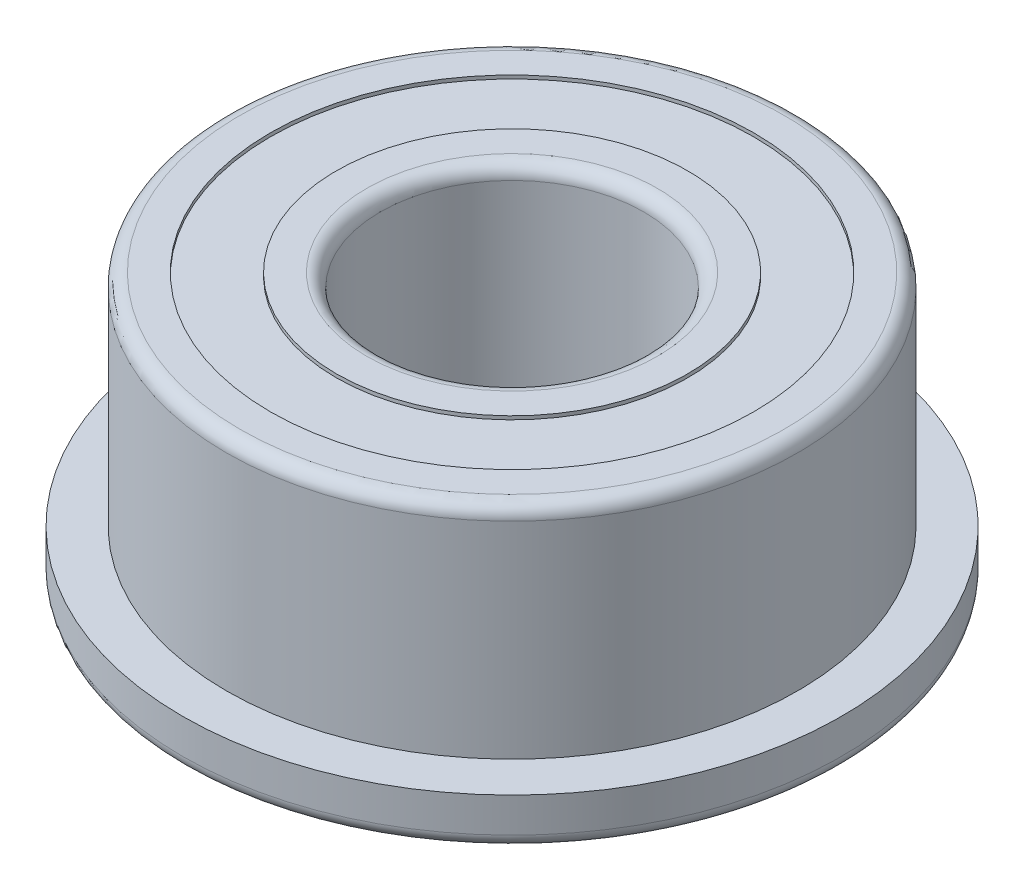
ISO-10303-21;
HEADER;
FILE_DESCRIPTION(('STEP AP214'),'2;1');
FILE_NAME('part.step','',(''),(''),'','','');
FILE_SCHEMA(('AUTOMOTIVE_DESIGN { 1 0 10303 214 1 1 1 1 }'));
ENDSEC;
DATA;
#1=APPLICATION_CONTEXT('core data for automotive mechanical design processes');
#2=APPLICATION_PROTOCOL_DEFINITION('international standard','automotive_design',2000,#1);
#3=PRODUCT_CONTEXT('',#1,'mechanical');
#4=PRODUCT('Part','Part','',(#3));
#5=PRODUCT_RELATED_PRODUCT_CATEGORY('part','',(#4));
#6=PRODUCT_DEFINITION_FORMATION('','',#4);
#7=PRODUCT_DEFINITION_CONTEXT('part definition',#1,'design');
#8=PRODUCT_DEFINITION('design','',#6,#7);
#9=PRODUCT_DEFINITION_SHAPE('','',#8);
#10=(LENGTH_UNIT() NAMED_UNIT(*) SI_UNIT(.MILLI.,.METRE.));
#11=(NAMED_UNIT(*) PLANE_ANGLE_UNIT() SI_UNIT($,.RADIAN.));
#12=(NAMED_UNIT(*) SI_UNIT($,.STERADIAN.) SOLID_ANGLE_UNIT());
#13=UNCERTAINTY_MEASURE_WITH_UNIT(LENGTH_MEASURE(1.E-05),#10,'distance_accuracy_value','');
#14=(GEOMETRIC_REPRESENTATION_CONTEXT(3) GLOBAL_UNCERTAINTY_ASSIGNED_CONTEXT((#13)) GLOBAL_UNIT_ASSIGNED_CONTEXT((#10,
#11,#12)) REPRESENTATION_CONTEXT('',''));
#15=CARTESIAN_POINT('',(0.,0.,0.));
#16=DIRECTION('',(0.,0.,1.));
#17=DIRECTION('',(1.,0.,0.));
#18=AXIS2_PLACEMENT_3D('',#15,#16,#17);
#19=CARTESIAN_POINT('',(0.,6.1,0.));
#20=DIRECTION('',(0.,1.,0.));
#21=DIRECTION('',(0.,0.,1.));
#22=AXIS2_PLACEMENT_3D('',#19,#20,#21);
#23=PLANE('',#22);
#24=CARTESIAN_POINT('',(0.,6.1,0.));
#25=DIRECTION('',(0.,1.,0.));
#26=DIRECTION('',(0.,0.,1.));
#27=AXIS2_PLACEMENT_3D('',#24,#25,#26);
#28=CIRCLE('',#27,3.31);
#29=CARTESIAN_POINT('',(0.,6.1,3.31));
#30=VERTEX_POINT('',#29);
#31=EDGE_CURVE('E10',#30,#30,#28,.F.);
#32=ORIENTED_EDGE('',*,*,#31,.T.);
#33=EDGE_LOOP('',(#32));
#34=FACE_BOUND('',#33,.T.);
#35=CARTESIAN_POINT('',(0.,6.1,0.));
#36=DIRECTION('',(0.,1.,0.));
#37=DIRECTION('',(0.,0.,1.));
#38=AXIS2_PLACEMENT_3D('',#35,#36,#37);
#39=CIRCLE('',#38,4.);
#40=CARTESIAN_POINT('',(0.,6.1,4.));
#41=VERTEX_POINT('',#40);
#42=EDGE_CURVE('E89',#41,#41,#39,.T.);
#43=ORIENTED_EDGE('',*,*,#42,.T.);
#44=EDGE_LOOP('',(#43));
#45=FACE_BOUND('',#44,.T.);
#46=ADVANCED_FACE('F32',(#34,#45),#23,.T.);
#47=CARTESIAN_POINT('',(0.,0.,0.));
#48=DIRECTION('',(0.,1.,0.));
#49=DIRECTION('',(0.,0.,1.));
#50=AXIS2_PLACEMENT_3D('',#47,#48,#49);
#51=PLANE('',#50);
#52=CARTESIAN_POINT('',(0.,0.,0.));
#53=DIRECTION('',(0.,1.,0.));
#54=DIRECTION('',(0.,0.,1.));
#55=AXIS2_PLACEMENT_3D('',#52,#53,#54);
#56=CIRCLE('',#55,3.31);
#57=CARTESIAN_POINT('',(0.,0.,3.31));
#58=VERTEX_POINT('',#57);
#59=EDGE_CURVE('E61',#58,#58,#56,.T.);
#60=ORIENTED_EDGE('',*,*,#59,.T.);
#61=EDGE_LOOP('',(#60));
#62=FACE_BOUND('',#61,.T.);
#63=CARTESIAN_POINT('',(0.,0.,0.));
#64=DIRECTION('',(0.,-1.,0.));
#65=DIRECTION('',(0.,0.,-1.));
#66=AXIS2_PLACEMENT_3D('',#63,#64,#65);
#67=CIRCLE('',#66,4.);
#68=CARTESIAN_POINT('',(0.,0.,-4.));
#69=VERTEX_POINT('',#68);
#70=EDGE_CURVE('E77',#69,#69,#67,.T.);
#71=ORIENTED_EDGE('',*,*,#70,.T.);
#72=EDGE_LOOP('',(#71));
#73=FACE_BOUND('',#72,.T.);
#74=ADVANCED_FACE('F127',(#62,#73),#51,.F.);
#75=CARTESIAN_POINT('',(0.,1.1,0.));
#76=DIRECTION('',(0.,-1.,0.));
#77=DIRECTION('',(0.,0.,-1.));
#78=AXIS2_PLACEMENT_3D('',#75,#76,#77);
#79=CYLINDRICAL_SURFACE('',#78,7.5);
#80=CARTESIAN_POINT('',(0.,0.31,0.));
#81=DIRECTION('',(0.,1.,0.));
#82=DIRECTION('',(0.,0.,1.));
#83=AXIS2_PLACEMENT_3D('',#80,#81,#82);
#84=CIRCLE('',#83,7.5);
#85=CARTESIAN_POINT('',(0.,0.31,7.5));
#86=VERTEX_POINT('',#85);
#87=EDGE_CURVE('E52',#86,#86,#84,.T.);
#88=ORIENTED_EDGE('',*,*,#87,.T.);
#89=EDGE_LOOP('',(#88));
#90=FACE_BOUND('',#89,.T.);
#91=CARTESIAN_POINT('',(0.,1.1,0.));
#92=DIRECTION('',(0.,1.,0.));
#93=DIRECTION('',(0.,0.,1.));
#94=AXIS2_PLACEMENT_3D('',#91,#92,#93);
#95=CIRCLE('',#94,7.5);
#96=CARTESIAN_POINT('',(0.,1.1,7.5));
#97=VERTEX_POINT('',#96);
#98=EDGE_CURVE('E65',#97,#97,#95,.T.);
#99=ORIENTED_EDGE('',*,*,#98,.F.);
#100=EDGE_LOOP('',(#99));
#101=FACE_BOUND('',#100,.T.);
#102=ADVANCED_FACE('F131',(#90,#101),#79,.T.);
#103=CARTESIAN_POINT('',(0.,1.1,0.));
#104=DIRECTION('',(0.,1.,0.));
#105=DIRECTION('',(0.,0.,1.));
#106=AXIS2_PLACEMENT_3D('',#103,#104,#105);
#107=PLANE('',#106);
#108=CARTESIAN_POINT('',(0.,1.1,0.));
#109=DIRECTION('',(0.,1.,0.));
#110=DIRECTION('',(0.,0.,1.));
#111=AXIS2_PLACEMENT_3D('',#108,#109,#110);
#112=CIRCLE('',#111,6.5);
#113=CARTESIAN_POINT('',(0.,1.1,6.5));
#114=VERTEX_POINT('',#113);
#115=EDGE_CURVE('E64',#114,#114,#112,.T.);
#116=ORIENTED_EDGE('',*,*,#115,.F.);
#117=EDGE_LOOP('',(#116));
#118=FACE_BOUND('',#117,.T.);
#119=ORIENTED_EDGE('',*,*,#98,.T.);
#120=EDGE_LOOP('',(#119));
#121=FACE_BOUND('',#120,.T.);
#122=ADVANCED_FACE('F162',(#118,#121),#107,.T.);
#123=CARTESIAN_POINT('',(0.,0.,0.));
#124=DIRECTION('',(0.,1.,0.));
#125=DIRECTION('',(0.,0.,1.));
#126=AXIS2_PLACEMENT_3D('',#123,#124,#125);
#127=CIRCLE('',#126,7.19);
#128=CARTESIAN_POINT('',(0.,0.,7.19));
#129=VERTEX_POINT('',#128);
#130=EDGE_CURVE('E47',#129,#129,#127,.F.);
#131=ORIENTED_EDGE('',*,*,#130,.T.);
#132=EDGE_LOOP('',(#131));
#133=FACE_BOUND('',#132,.T.);
#134=CARTESIAN_POINT('',(0.,0.,0.));
#135=DIRECTION('',(0.,-1.,0.));
#136=DIRECTION('',(0.,0.,-1.));
#137=AXIS2_PLACEMENT_3D('',#134,#135,#136);
#138=CIRCLE('',#137,6.5);
#139=CARTESIAN_POINT('',(0.,0.,-6.5));
#140=VERTEX_POINT('',#139);
#141=EDGE_CURVE('E71',#140,#140,#138,.T.);
#142=ORIENTED_EDGE('',*,*,#141,.F.);
#143=EDGE_LOOP('',(#142));
#144=FACE_BOUND('',#143,.T.);
#145=ADVANCED_FACE('F124',(#133,#144),#51,.F.);
#146=CARTESIAN_POINT('',(0.,6.1,0.));
#147=DIRECTION('',(0.,-1.,0.));
#148=DIRECTION('',(0.,0.,-1.));
#149=AXIS2_PLACEMENT_3D('',#146,#147,#148);
#150=CYLINDRICAL_SURFACE('',#149,6.5);
#151=CARTESIAN_POINT('',(0.,5.79,0.));
#152=DIRECTION('',(0.,1.,0.));
#153=DIRECTION('',(0.,0.,1.));
#154=AXIS2_PLACEMENT_3D('',#151,#152,#153);
#155=CIRCLE('',#154,6.5);
#156=CARTESIAN_POINT('',(0.,5.79,6.5));
#157=VERTEX_POINT('',#156);
#158=EDGE_CURVE('E39',#157,#157,#155,.F.);
#159=ORIENTED_EDGE('',*,*,#158,.T.);
#160=EDGE_LOOP('',(#159));
#161=FACE_BOUND('',#160,.T.);
#162=ORIENTED_EDGE('',*,*,#115,.T.);
#163=EDGE_LOOP('',(#162));
#164=FACE_BOUND('',#163,.T.);
#165=ADVANCED_FACE('F114',(#161,#164),#150,.T.);
#166=CARTESIAN_POINT('',(0.,6.1,0.));
#167=DIRECTION('',(0.,1.,0.));
#168=DIRECTION('',(0.,0.,1.));
#169=AXIS2_PLACEMENT_3D('',#166,#167,#168);
#170=CIRCLE('',#169,6.19);
#171=CARTESIAN_POINT('',(0.,6.1,6.19));
#172=VERTEX_POINT('',#171);
#173=EDGE_CURVE('E43',#172,#172,#170,.T.);
#174=ORIENTED_EDGE('',*,*,#173,.T.);
#175=EDGE_LOOP('',(#174));
#176=FACE_BOUND('',#175,.T.);
#177=CARTESIAN_POINT('',(0.,6.1,0.));
#178=DIRECTION('',(0.,1.,0.));
#179=DIRECTION('',(0.,0.,1.));
#180=AXIS2_PLACEMENT_3D('',#177,#178,#179);
#181=CIRCLE('',#180,5.5);
#182=CARTESIAN_POINT('',(0.,6.1,5.5));
#183=VERTEX_POINT('',#182);
#184=EDGE_CURVE('E83',#183,#183,#181,.T.);
#185=ORIENTED_EDGE('',*,*,#184,.F.);
#186=EDGE_LOOP('',(#185));
#187=FACE_BOUND('',#186,.T.);
#188=ADVANCED_FACE('F111',(#176,#187),#23,.T.);
#189=CARTESIAN_POINT('',(0.,0.,0.));
#190=DIRECTION('',(0.,1.,0.));
#191=DIRECTION('',(0.,0.,1.));
#192=AXIS2_PLACEMENT_3D('',#189,#190,#191);
#193=CYLINDRICAL_SURFACE('',#192,3.);
#194=CARTESIAN_POINT('',(0.,0.31,0.));
#195=DIRECTION('',(0.,1.,0.));
#196=DIRECTION('',(0.,0.,1.));
#197=AXIS2_PLACEMENT_3D('',#194,#195,#196);
#198=CIRCLE('',#197,3.);
#199=CARTESIAN_POINT('',(0.,0.31,3.));
#200=VERTEX_POINT('',#199);
#201=EDGE_CURVE('E55',#200,#200,#198,.F.);
#202=CARTESIAN_POINT('',(0.,5.79,0.));
#203=DIRECTION('',(0.,1.,0.));
#204=DIRECTION('',(0.,0.,1.));
#205=AXIS2_PLACEMENT_3D('',#202,#203,#204);
#206=CIRCLE('',#205,3.);
#207=CARTESIAN_POINT('',(0.,5.79,3.));
#208=VERTEX_POINT('',#207);
#209=EDGE_CURVE('E58',#208,#208,#206,.T.);
#210=CARTESIAN_POINT('',(0.,0.31,3.));
#211=CARTESIAN_POINT('',(0.,0.367083333333333,3.));
#212=CARTESIAN_POINT('',(0.,0.424166666666667,3.));
#213=CARTESIAN_POINT('',(0.,0.538333333333333,3.));
#214=CARTESIAN_POINT('',(0.,0.595416666666667,3.));
#215=CARTESIAN_POINT('',(0.,0.709583333333333,3.));
#216=CARTESIAN_POINT('',(0.,0.766666666666667,3.));
#217=CARTESIAN_POINT('',(0.,0.880833333333333,3.));
#218=CARTESIAN_POINT('',(0.,0.937916666666667,3.));
#219=CARTESIAN_POINT('',(0.,1.05208333333333,3.));
#220=CARTESIAN_POINT('',(0.,1.10916666666667,3.));
#221=CARTESIAN_POINT('',(0.,1.22333333333333,3.));
#222=CARTESIAN_POINT('',(0.,1.28041666666667,3.));
#223=CARTESIAN_POINT('',(0.,1.39458333333333,3.));
#224=CARTESIAN_POINT('',(0.,1.45166666666667,3.));
#225=CARTESIAN_POINT('',(0.,1.56583333333333,3.));
#226=CARTESIAN_POINT('',(0.,1.62291666666667,3.));
#227=CARTESIAN_POINT('',(0.,1.73708333333333,3.));
#228=CARTESIAN_POINT('',(0.,1.79416666666667,3.));
#229=CARTESIAN_POINT('',(0.,1.90833333333333,3.));
#230=CARTESIAN_POINT('',(0.,1.96541666666667,3.));
#231=CARTESIAN_POINT('',(0.,2.07958333333333,3.));
#232=CARTESIAN_POINT('',(0.,2.13666666666667,3.));
#233=CARTESIAN_POINT('',(0.,2.25083333333333,3.));
#234=CARTESIAN_POINT('',(0.,2.30791666666667,3.));
#235=CARTESIAN_POINT('',(0.,2.42208333333333,3.));
#236=CARTESIAN_POINT('',(0.,2.47916666666667,3.));
#237=CARTESIAN_POINT('',(0.,2.59333333333333,3.));
#238=CARTESIAN_POINT('',(0.,2.65041666666667,3.));
#239=CARTESIAN_POINT('',(0.,2.76458333333333,3.));
#240=CARTESIAN_POINT('',(0.,2.82166666666667,3.));
#241=CARTESIAN_POINT('',(0.,2.93583333333333,3.));
#242=CARTESIAN_POINT('',(0.,2.99291666666667,3.));
#243=CARTESIAN_POINT('',(0.,3.10708333333333,3.));
#244=CARTESIAN_POINT('',(0.,3.16416666666667,3.));
#245=CARTESIAN_POINT('',(0.,3.27833333333333,3.));
#246=CARTESIAN_POINT('',(0.,3.33541666666667,3.));
#247=CARTESIAN_POINT('',(0.,3.44958333333333,3.));
#248=CARTESIAN_POINT('',(0.,3.50666666666667,3.));
#249=CARTESIAN_POINT('',(0.,3.62083333333333,3.));
#250=CARTESIAN_POINT('',(0.,3.67791666666667,3.));
#251=CARTESIAN_POINT('',(0.,3.79208333333333,3.));
#252=CARTESIAN_POINT('',(0.,3.84916666666667,3.));
#253=CARTESIAN_POINT('',(0.,3.96333333333333,3.));
#254=CARTESIAN_POINT('',(0.,4.02041666666666,3.));
#255=CARTESIAN_POINT('',(0.,4.13458333333333,3.));
#256=CARTESIAN_POINT('',(0.,4.19166666666667,3.));
#257=CARTESIAN_POINT('',(0.,4.30583333333333,3.));
#258=CARTESIAN_POINT('',(0.,4.36291666666667,3.));
#259=CARTESIAN_POINT('',(0.,4.47708333333333,3.));
#260=CARTESIAN_POINT('',(0.,4.53416666666667,3.));
#261=CARTESIAN_POINT('',(0.,4.64833333333333,3.));
#262=CARTESIAN_POINT('',(0.,4.70541666666667,3.));
#263=CARTESIAN_POINT('',(0.,4.81958333333333,3.));
#264=CARTESIAN_POINT('',(0.,4.87666666666667,3.));
#265=CARTESIAN_POINT('',(0.,4.99083333333333,3.));
#266=CARTESIAN_POINT('',(0.,5.04791666666667,3.));
#267=CARTESIAN_POINT('',(0.,5.16208333333333,3.));
#268=CARTESIAN_POINT('',(0.,5.21916666666667,3.));
#269=CARTESIAN_POINT('',(0.,5.33333333333333,3.));
#270=CARTESIAN_POINT('',(0.,5.39041666666667,3.));
#271=CARTESIAN_POINT('',(0.,5.50458333333333,3.));
#272=CARTESIAN_POINT('',(0.,5.56166666666667,3.));
#273=CARTESIAN_POINT('',(0.,5.67583333333333,3.));
#274=CARTESIAN_POINT('',(0.,5.73291666666667,3.));
#275=CARTESIAN_POINT('',(0.,5.79,3.));
#276=B_SPLINE_CURVE_WITH_KNOTS('',3,(#210,#211,#212,#213,#214,#215,#216,#217,#218,#219,#220,
#221,#222,#223,#224,#225,#226,#227,#228,#229,#230,#231,#232,#233,#234,#235,#236,#237,#238,#239,
#240,#241,#242,#243,#244,#245,#246,#247,#248,#249,#250,#251,#252,#253,#254,#255,#256,#257,#258,
#259,#260,#261,#262,#263,#264,#265,#266,#267,#268,#269,#270,#271,#272,#273,#274,#275),
.UNSPECIFIED.,.F.,.F.,(4,2,2,2,2,2,2,2,2,2,2,2,2,2,2,2,2,2,2,2,2,2,2,2,2,2,2,2,2,2,2,2,4),(0.,
0.17125,0.3425,0.51375,0.685,0.85625,1.0275,1.19875,1.37,1.54125,1.7125,1.88375,2.055,2.22625,
2.3975,2.56875,2.74,2.91125,3.0825,3.25375,3.425,3.59625,3.7675,3.93875,4.11,4.28125,4.4525,
4.62375,4.795,4.96625,5.1375,5.30875,5.48),.UNSPECIFIED.);
#277=EDGE_CURVE('BSEAM113',#200,#208,#276,.T.);
#278=ORIENTED_EDGE('',*,*,#201,.T.);
#279=ORIENTED_EDGE('',*,*,#209,.T.);
#280=ORIENTED_EDGE('',*,*,#277,.T.);
#281=ORIENTED_EDGE('',*,*,#277,.F.);
#282=EDGE_LOOP('',(#278,#280,#279,#281));
#283=FACE_BOUND('',#282,.T.);
#284=ADVANCED_FACE('F113',(#283),#193,.F.);
#285=CARTESIAN_POINT('',(0.,0.08,0.));
#286=DIRECTION('',(0.,-1.,0.));
#287=DIRECTION('',(0.,0.,-1.));
#288=AXIS2_PLACEMENT_3D('',#285,#286,#287);
#289=CYLINDRICAL_SURFACE('',#288,6.5);
#290=CARTESIAN_POINT('',(0.,0.08,0.));
#291=DIRECTION('',(0.,-1.,0.));
#292=DIRECTION('',(0.,0.,-1.));
#293=AXIS2_PLACEMENT_3D('',#290,#291,#292);
#294=CIRCLE('',#293,6.5);
#295=CARTESIAN_POINT('',(0.,0.08,-6.5));
#296=VERTEX_POINT('',#295);
#297=EDGE_CURVE('E68',#296,#296,#294,.T.);
#298=CARTESIAN_POINT('',(0.,0.08,-6.5));
#299=CARTESIAN_POINT('',(0.,0.0791666666666667,-6.5));
#300=CARTESIAN_POINT('',(0.,0.0783333333333333,-6.5));
#301=CARTESIAN_POINT('',(0.,0.0766666666666667,-6.5));
#302=CARTESIAN_POINT('',(0.,0.0758333333333333,-6.5));
#303=CARTESIAN_POINT('',(0.,0.0741666666666667,-6.5));
#304=CARTESIAN_POINT('',(0.,0.0733333333333333,-6.5));
#305=CARTESIAN_POINT('',(0.,0.0716666666666667,-6.5));
#306=CARTESIAN_POINT('',(0.,0.0708333333333333,-6.5));
#307=CARTESIAN_POINT('',(0.,0.0691666666666667,-6.5));
#308=CARTESIAN_POINT('',(0.,0.0683333333333333,-6.5));
#309=CARTESIAN_POINT('',(0.,0.0666666666666667,-6.5));
#310=CARTESIAN_POINT('',(0.,0.0658333333333333,-6.5));
#311=CARTESIAN_POINT('',(0.,0.0641666666666667,-6.5));
#312=CARTESIAN_POINT('',(0.,0.0633333333333333,-6.5));
#313=CARTESIAN_POINT('',(0.,0.0616666666666667,-6.5));
#314=CARTESIAN_POINT('',(0.,0.0608333333333333,-6.5));
#315=CARTESIAN_POINT('',(0.,0.0591666666666667,-6.5));
#316=CARTESIAN_POINT('',(0.,0.0583333333333333,-6.5));
#317=CARTESIAN_POINT('',(0.,0.0566666666666667,-6.5));
#318=CARTESIAN_POINT('',(0.,0.0558333333333333,-6.5));
#319=CARTESIAN_POINT('',(0.,0.0541666666666667,-6.5));
#320=CARTESIAN_POINT('',(0.,0.0533333333333333,-6.5));
#321=CARTESIAN_POINT('',(0.,0.0516666666666667,-6.5));
#322=CARTESIAN_POINT('',(0.,0.0508333333333333,-6.5));
#323=CARTESIAN_POINT('',(0.,0.0491666666666667,-6.5));
#324=CARTESIAN_POINT('',(0.,0.0483333333333333,-6.5));
#325=CARTESIAN_POINT('',(0.,0.0466666666666667,-6.5));
#326=CARTESIAN_POINT('',(0.,0.0458333333333333,-6.5));
#327=CARTESIAN_POINT('',(0.,0.0441666666666667,-6.5));
#328=CARTESIAN_POINT('',(0.,0.0433333333333333,-6.5));
#329=CARTESIAN_POINT('',(0.,0.0416666666666667,-6.5));
#330=CARTESIAN_POINT('',(0.,0.0408333333333333,-6.5));
#331=CARTESIAN_POINT('',(0.,0.0391666666666667,-6.5));
#332=CARTESIAN_POINT('',(0.,0.0383333333333333,-6.5));
#333=CARTESIAN_POINT('',(0.,0.0366666666666667,-6.5));
#334=CARTESIAN_POINT('',(0.,0.0358333333333333,-6.5));
#335=CARTESIAN_POINT('',(0.,0.0341666666666667,-6.5));
#336=CARTESIAN_POINT('',(0.,0.0333333333333333,-6.5));
#337=CARTESIAN_POINT('',(0.,0.0316666666666667,-6.5));
#338=CARTESIAN_POINT('',(0.,0.0308333333333333,-6.5));
#339=CARTESIAN_POINT('',(0.,0.0291666666666667,-6.5));
#340=CARTESIAN_POINT('',(0.,0.0283333333333333,-6.5));
#341=CARTESIAN_POINT('',(0.,0.0266666666666667,-6.5));
#342=CARTESIAN_POINT('',(0.,0.0258333333333333,-6.5));
#343=CARTESIAN_POINT('',(0.,0.0241666666666667,-6.5));
#344=CARTESIAN_POINT('',(0.,0.0233333333333333,-6.5));
#345=CARTESIAN_POINT('',(0.,0.0216666666666667,-6.5));
#346=CARTESIAN_POINT('',(0.,0.0208333333333333,-6.5));
#347=CARTESIAN_POINT('',(0.,0.0191666666666667,-6.5));
#348=CARTESIAN_POINT('',(0.,0.0183333333333333,-6.5));
#349=CARTESIAN_POINT('',(0.,0.0166666666666667,-6.5));
#350=CARTESIAN_POINT('',(0.,0.0158333333333333,-6.5));
#351=CARTESIAN_POINT('',(0.,0.0141666666666667,-6.5));
#352=CARTESIAN_POINT('',(0.,0.0133333333333333,-6.5));
#353=CARTESIAN_POINT('',(0.,0.0116666666666667,-6.5));
#354=CARTESIAN_POINT('',(0.,0.0108333333333333,-6.5));
#355=CARTESIAN_POINT('',(0.,0.00916666666666667,-6.5));
#356=CARTESIAN_POINT('',(0.,0.00833333333333334,-6.5));
#357=CARTESIAN_POINT('',(0.,0.00666666666666667,-6.5));
#358=CARTESIAN_POINT('',(0.,0.00583333333333333,-6.5));
#359=CARTESIAN_POINT('',(0.,0.00416666666666667,-6.5));
#360=CARTESIAN_POINT('',(0.,0.00333333333333334,-6.5));
#361=CARTESIAN_POINT('',(0.,0.00166666666666667,-6.5));
#362=CARTESIAN_POINT('',(0.,0.000833333333333335,-6.5));
#363=CARTESIAN_POINT('',(0.,0.,-6.5));
#364=B_SPLINE_CURVE_WITH_KNOTS('',3,(#298,#299,#300,#301,#302,#303,#304,#305,#306,#307,#308,
#309,#310,#311,#312,#313,#314,#315,#316,#317,#318,#319,#320,#321,#322,#323,#324,#325,#326,#327,
#328,#329,#330,#331,#332,#333,#334,#335,#336,#337,#338,#339,#340,#341,#342,#343,#344,#345,#346,
#347,#348,#349,#350,#351,#352,#353,#354,#355,#356,#357,#358,#359,#360,#361,#362,#363),
.UNSPECIFIED.,.F.,.F.,(4,2,2,2,2,2,2,2,2,2,2,2,2,2,2,2,2,2,2,2,2,2,2,2,2,2,2,2,2,2,2,2,4),(0.,
0.00250000000000001,0.00500000000000001,0.00750000000000001,0.01,0.0125,0.015,0.0175,0.02,
0.0225,0.025,0.0275,0.03,0.0325,0.035,0.0375,0.04,0.0425,0.045,0.0475,0.05,0.0525,0.055,0.0575,
0.06,0.0625,0.065,0.0675,0.07,0.0725,0.075,0.0775,0.08),.UNSPECIFIED.);
#365=EDGE_CURVE('BSEAM121',#296,#140,#364,.T.);
#366=ORIENTED_EDGE('',*,*,#297,.F.);
#367=ORIENTED_EDGE('',*,*,#141,.T.);
#368=ORIENTED_EDGE('',*,*,#365,.T.);
#369=ORIENTED_EDGE('',*,*,#365,.F.);
#370=EDGE_LOOP('',(#366,#368,#367,#369));
#371=FACE_BOUND('',#370,.T.);
#372=ADVANCED_FACE('F121',(#371),#289,.F.);
#373=CARTESIAN_POINT('',(0.,0.08,0.));
#374=DIRECTION('',(0.,-1.,0.));
#375=DIRECTION('',(0.,0.,-1.));
#376=AXIS2_PLACEMENT_3D('',#373,#374,#375);
#377=PLANE('',#376);
#378=CARTESIAN_POINT('',(0.,0.08,0.));
#379=DIRECTION('',(0.,-1.,0.));
#380=DIRECTION('',(0.,0.,-1.));
#381=AXIS2_PLACEMENT_3D('',#378,#379,#380);
#382=CIRCLE('',#381,4.);
#383=CARTESIAN_POINT('',(0.,0.08,-4.));
#384=VERTEX_POINT('',#383);
#385=EDGE_CURVE('E74',#384,#384,#382,.T.);
#386=ORIENTED_EDGE('',*,*,#385,.F.);
#387=EDGE_LOOP('',(#386));
#388=FACE_BOUND('',#387,.T.);
#389=ORIENTED_EDGE('',*,*,#297,.T.);
#390=EDGE_LOOP('',(#389));
#391=FACE_BOUND('',#390,.T.);
#392=ADVANCED_FACE('F148',(#388,#391),#377,.T.);
#393=CARTESIAN_POINT('',(0.,0.08,0.));
#394=DIRECTION('',(0.,-1.,0.));
#395=DIRECTION('',(0.,0.,-1.));
#396=AXIS2_PLACEMENT_3D('',#393,#394,#395);
#397=CYLINDRICAL_SURFACE('',#396,4.);
#398=CARTESIAN_POINT('',(0.,0.08,-4.));
#399=CARTESIAN_POINT('',(0.,0.0791666666666667,-4.));
#400=CARTESIAN_POINT('',(0.,0.0783333333333333,-4.));
#401=CARTESIAN_POINT('',(0.,0.0766666666666667,-4.));
#402=CARTESIAN_POINT('',(0.,0.0758333333333333,-4.));
#403=CARTESIAN_POINT('',(0.,0.0741666666666667,-4.));
#404=CARTESIAN_POINT('',(0.,0.0733333333333333,-4.));
#405=CARTESIAN_POINT('',(0.,0.0716666666666667,-4.));
#406=CARTESIAN_POINT('',(0.,0.0708333333333333,-4.));
#407=CARTESIAN_POINT('',(0.,0.0691666666666667,-4.));
#408=CARTESIAN_POINT('',(0.,0.0683333333333333,-4.));
#409=CARTESIAN_POINT('',(0.,0.0666666666666667,-4.));
#410=CARTESIAN_POINT('',(0.,0.0658333333333333,-4.));
#411=CARTESIAN_POINT('',(0.,0.0641666666666667,-4.));
#412=CARTESIAN_POINT('',(0.,0.0633333333333333,-4.));
#413=CARTESIAN_POINT('',(0.,0.0616666666666667,-4.));
#414=CARTESIAN_POINT('',(0.,0.0608333333333333,-4.));
#415=CARTESIAN_POINT('',(0.,0.0591666666666667,-4.));
#416=CARTESIAN_POINT('',(0.,0.0583333333333333,-4.));
#417=CARTESIAN_POINT('',(0.,0.0566666666666667,-4.));
#418=CARTESIAN_POINT('',(0.,0.0558333333333333,-4.));
#419=CARTESIAN_POINT('',(0.,0.0541666666666667,-4.));
#420=CARTESIAN_POINT('',(0.,0.0533333333333333,-4.));
#421=CARTESIAN_POINT('',(0.,0.0516666666666667,-4.));
#422=CARTESIAN_POINT('',(0.,0.0508333333333333,-4.));
#423=CARTESIAN_POINT('',(0.,0.0491666666666667,-4.));
#424=CARTESIAN_POINT('',(0.,0.0483333333333333,-4.));
#425=CARTESIAN_POINT('',(0.,0.0466666666666667,-4.));
#426=CARTESIAN_POINT('',(0.,0.0458333333333333,-4.));
#427=CARTESIAN_POINT('',(0.,0.0441666666666667,-4.));
#428=CARTESIAN_POINT('',(0.,0.0433333333333333,-4.));
#429=CARTESIAN_POINT('',(0.,0.0416666666666667,-4.));
#430=CARTESIAN_POINT('',(0.,0.0408333333333333,-4.));
#431=CARTESIAN_POINT('',(0.,0.0391666666666667,-4.));
#432=CARTESIAN_POINT('',(0.,0.0383333333333333,-4.));
#433=CARTESIAN_POINT('',(0.,0.0366666666666667,-4.));
#434=CARTESIAN_POINT('',(0.,0.0358333333333333,-4.));
#435=CARTESIAN_POINT('',(0.,0.0341666666666667,-4.));
#436=CARTESIAN_POINT('',(0.,0.0333333333333333,-4.));
#437=CARTESIAN_POINT('',(0.,0.0316666666666667,-4.));
#438=CARTESIAN_POINT('',(0.,0.0308333333333333,-4.));
#439=CARTESIAN_POINT('',(0.,0.0291666666666667,-4.));
#440=CARTESIAN_POINT('',(0.,0.0283333333333333,-4.));
#441=CARTESIAN_POINT('',(0.,0.0266666666666667,-4.));
#442=CARTESIAN_POINT('',(0.,0.0258333333333333,-4.));
#443=CARTESIAN_POINT('',(0.,0.0241666666666667,-4.));
#444=CARTESIAN_POINT('',(0.,0.0233333333333333,-4.));
#445=CARTESIAN_POINT('',(0.,0.0216666666666667,-4.));
#446=CARTESIAN_POINT('',(0.,0.0208333333333333,-4.));
#447=CARTESIAN_POINT('',(0.,0.0191666666666667,-4.));
#448=CARTESIAN_POINT('',(0.,0.0183333333333333,-4.));
#449=CARTESIAN_POINT('',(0.,0.0166666666666667,-4.));
#450=CARTESIAN_POINT('',(0.,0.0158333333333333,-4.));
#451=CARTESIAN_POINT('',(0.,0.0141666666666667,-4.));
#452=CARTESIAN_POINT('',(0.,0.0133333333333333,-4.));
#453=CARTESIAN_POINT('',(0.,0.0116666666666667,-4.));
#454=CARTESIAN_POINT('',(0.,0.0108333333333333,-4.));
#455=CARTESIAN_POINT('',(0.,0.00916666666666667,-4.));
#456=CARTESIAN_POINT('',(0.,0.00833333333333334,-4.));
#457=CARTESIAN_POINT('',(0.,0.00666666666666667,-4.));
#458=CARTESIAN_POINT('',(0.,0.00583333333333333,-4.));
#459=CARTESIAN_POINT('',(0.,0.00416666666666667,-4.));
#460=CARTESIAN_POINT('',(0.,0.00333333333333334,-4.));
#461=CARTESIAN_POINT('',(0.,0.00166666666666667,-4.));
#462=CARTESIAN_POINT('',(0.,0.000833333333333335,-4.));
#463=CARTESIAN_POINT('',(0.,0.,-4.));
#464=B_SPLINE_CURVE_WITH_KNOTS('',3,(#398,#399,#400,#401,#402,#403,#404,#405,#406,#407,#408,
#409,#410,#411,#412,#413,#414,#415,#416,#417,#418,#419,#420,#421,#422,#423,#424,#425,#426,#427,
#428,#429,#430,#431,#432,#433,#434,#435,#436,#437,#438,#439,#440,#441,#442,#443,#444,#445,#446,
#447,#448,#449,#450,#451,#452,#453,#454,#455,#456,#457,#458,#459,#460,#461,#462,#463),
.UNSPECIFIED.,.F.,.F.,(4,2,2,2,2,2,2,2,2,2,2,2,2,2,2,2,2,2,2,2,2,2,2,2,2,2,2,2,2,2,2,2,4),(0.,
0.00250000000000001,0.00500000000000001,0.00750000000000001,0.01,0.0125,0.015,0.0175,0.02,
0.0225,0.025,0.0275,0.03,0.0325,0.035,0.0375,0.04,0.0425,0.045,0.0475,0.05,0.0525,0.055,0.0575,
0.06,0.0625,0.065,0.0675,0.07,0.0725,0.075,0.0775,0.08),.UNSPECIFIED.);
#465=EDGE_CURVE('BSEAM107',#384,#69,#464,.T.);
#466=ORIENTED_EDGE('',*,*,#385,.T.);
#467=ORIENTED_EDGE('',*,*,#70,.F.);
#468=ORIENTED_EDGE('',*,*,#465,.T.);
#469=ORIENTED_EDGE('',*,*,#465,.F.);
#470=EDGE_LOOP('',(#466,#468,#467,#469));
#471=FACE_BOUND('',#470,.T.);
#472=ADVANCED_FACE('F107',(#471),#397,.T.);
#473=CARTESIAN_POINT('',(0.,6.02,0.));
#474=DIRECTION('',(0.,1.,0.));
#475=DIRECTION('',(0.,0.,1.));
#476=AXIS2_PLACEMENT_3D('',#473,#474,#475);
#477=CYLINDRICAL_SURFACE('',#476,5.5);
#478=CARTESIAN_POINT('',(0.,6.02,0.));
#479=DIRECTION('',(0.,1.,0.));
#480=DIRECTION('',(0.,0.,1.));
#481=AXIS2_PLACEMENT_3D('',#478,#479,#480);
#482=CIRCLE('',#481,5.5);
#483=CARTESIAN_POINT('',(0.,6.02,5.5));
#484=VERTEX_POINT('',#483);
#485=EDGE_CURVE('E80',#484,#484,#482,.T.);
#486=CARTESIAN_POINT('',(0.,6.02,5.5));
#487=CARTESIAN_POINT('',(0.,6.02083333333333,5.5));
#488=CARTESIAN_POINT('',(0.,6.02166666666667,5.5));
#489=CARTESIAN_POINT('',(0.,6.02333333333333,5.5));
#490=CARTESIAN_POINT('',(0.,6.02416666666667,5.5));
#491=CARTESIAN_POINT('',(0.,6.02583333333333,5.5));
#492=CARTESIAN_POINT('',(0.,6.02666666666667,5.5));
#493=CARTESIAN_POINT('',(0.,6.02833333333333,5.5));
#494=CARTESIAN_POINT('',(0.,6.02916666666667,5.5));
#495=CARTESIAN_POINT('',(0.,6.03083333333333,5.5));
#496=CARTESIAN_POINT('',(0.,6.03166666666667,5.5));
#497=CARTESIAN_POINT('',(0.,6.03333333333333,5.5));
#498=CARTESIAN_POINT('',(0.,6.03416666666667,5.5));
#499=CARTESIAN_POINT('',(0.,6.03583333333333,5.5));
#500=CARTESIAN_POINT('',(0.,6.03666666666667,5.5));
#501=CARTESIAN_POINT('',(0.,6.03833333333333,5.5));
#502=CARTESIAN_POINT('',(0.,6.03916666666667,5.5));
#503=CARTESIAN_POINT('',(0.,6.04083333333333,5.5));
#504=CARTESIAN_POINT('',(0.,6.04166666666667,5.5));
#505=CARTESIAN_POINT('',(0.,6.04333333333333,5.5));
#506=CARTESIAN_POINT('',(0.,6.04416666666667,5.5));
#507=CARTESIAN_POINT('',(0.,6.04583333333333,5.5));
#508=CARTESIAN_POINT('',(0.,6.04666666666667,5.5));
#509=CARTESIAN_POINT('',(0.,6.04833333333333,5.5));
#510=CARTESIAN_POINT('',(0.,6.04916666666667,5.5));
#511=CARTESIAN_POINT('',(0.,6.05083333333333,5.5));
#512=CARTESIAN_POINT('',(0.,6.05166666666667,5.5));
#513=CARTESIAN_POINT('',(0.,6.05333333333333,5.5));
#514=CARTESIAN_POINT('',(0.,6.05416666666667,5.5));
#515=CARTESIAN_POINT('',(0.,6.05583333333333,5.5));
#516=CARTESIAN_POINT('',(0.,6.05666666666667,5.5));
#517=CARTESIAN_POINT('',(0.,6.05833333333333,5.5));
#518=CARTESIAN_POINT('',(0.,6.05916666666667,5.5));
#519=CARTESIAN_POINT('',(0.,6.06083333333333,5.5));
#520=CARTESIAN_POINT('',(0.,6.06166666666667,5.5));
#521=CARTESIAN_POINT('',(0.,6.06333333333333,5.5));
#522=CARTESIAN_POINT('',(0.,6.06416666666667,5.5));
#523=CARTESIAN_POINT('',(0.,6.06583333333333,5.5));
#524=CARTESIAN_POINT('',(0.,6.06666666666667,5.5));
#525=CARTESIAN_POINT('',(0.,6.06833333333333,5.5));
#526=CARTESIAN_POINT('',(0.,6.06916666666667,5.5));
#527=CARTESIAN_POINT('',(0.,6.07083333333333,5.5));
#528=CARTESIAN_POINT('',(0.,6.07166666666667,5.5));
#529=CARTESIAN_POINT('',(0.,6.07333333333333,5.5));
#530=CARTESIAN_POINT('',(0.,6.07416666666667,5.5));
#531=CARTESIAN_POINT('',(0.,6.07583333333333,5.5));
#532=CARTESIAN_POINT('',(0.,6.07666666666667,5.5));
#533=CARTESIAN_POINT('',(0.,6.07833333333333,5.5));
#534=CARTESIAN_POINT('',(0.,6.07916666666667,5.5));
#535=CARTESIAN_POINT('',(0.,6.08083333333333,5.5));
#536=CARTESIAN_POINT('',(0.,6.08166666666667,5.5));
#537=CARTESIAN_POINT('',(0.,6.08333333333333,5.5));
#538=CARTESIAN_POINT('',(0.,6.08416666666667,5.5));
#539=CARTESIAN_POINT('',(0.,6.08583333333333,5.5));
#540=CARTESIAN_POINT('',(0.,6.08666666666667,5.5));
#541=CARTESIAN_POINT('',(0.,6.08833333333333,5.5));
#542=CARTESIAN_POINT('',(0.,6.08916666666667,5.5));
#543=CARTESIAN_POINT('',(0.,6.09083333333333,5.5));
#544=CARTESIAN_POINT('',(0.,6.09166666666667,5.5));
#545=CARTESIAN_POINT('',(0.,6.09333333333333,5.5));
#546=CARTESIAN_POINT('',(0.,6.09416666666667,5.5));
#547=CARTESIAN_POINT('',(0.,6.09583333333333,5.5));
#548=CARTESIAN_POINT('',(0.,6.09666666666667,5.5));
#549=CARTESIAN_POINT('',(0.,6.09833333333333,5.5));
#550=CARTESIAN_POINT('',(0.,6.09916666666667,5.5));
#551=CARTESIAN_POINT('',(0.,6.1,5.5));
#552=B_SPLINE_CURVE_WITH_KNOTS('',3,(#486,#487,#488,#489,#490,#491,#492,#493,#494,#495,#496,
#497,#498,#499,#500,#501,#502,#503,#504,#505,#506,#507,#508,#509,#510,#511,#512,#513,#514,#515,
#516,#517,#518,#519,#520,#521,#522,#523,#524,#525,#526,#527,#528,#529,#530,#531,#532,#533,#534,
#535,#536,#537,#538,#539,#540,#541,#542,#543,#544,#545,#546,#547,#548,#549,#550,#551),
.UNSPECIFIED.,.F.,.F.,(4,2,2,2,2,2,2,2,2,2,2,2,2,2,2,2,2,2,2,2,2,2,2,2,2,2,2,2,2,2,2,2,4),(0.,
0.00250000000000077,0.00500000000000066,0.00750000000000056,0.0100000000000005,
0.0125000000000004,0.0150000000000003,0.0175000000000002,0.0200000000000009,0.0225000000000008,
0.0250000000000007,0.0275000000000006,0.0300000000000005,0.0325000000000004,0.0350000000000003,
0.0375000000000002,0.040000000000001,0.0425000000000009,0.0450000000000008,0.0475000000000007,
0.0500000000000006,0.0525000000000005,0.0550000000000004,0.0575000000000003,0.060000000000001,
0.0625000000000009,0.0650000000000008,0.0675000000000007,0.0700000000000006,0.0725000000000005,
0.0750000000000004,0.0775000000000003,0.0800000000000011),.UNSPECIFIED.);
#553=EDGE_CURVE('BSEAM101',#484,#183,#552,.T.);
#554=ORIENTED_EDGE('',*,*,#485,.F.);
#555=ORIENTED_EDGE('',*,*,#184,.T.);
#556=ORIENTED_EDGE('',*,*,#553,.T.);
#557=ORIENTED_EDGE('',*,*,#553,.F.);
#558=EDGE_LOOP('',(#554,#556,#555,#557));
#559=FACE_BOUND('',#558,.T.);
#560=ADVANCED_FACE('F101',(#559),#477,.F.);
#561=CARTESIAN_POINT('',(0.,6.02,0.));
#562=DIRECTION('',(0.,1.,0.));
#563=DIRECTION('',(0.,0.,1.));
#564=AXIS2_PLACEMENT_3D('',#561,#562,#563);
#565=PLANE('',#564);
#566=CARTESIAN_POINT('',(0.,6.02,0.));
#567=DIRECTION('',(0.,1.,0.));
#568=DIRECTION('',(0.,0.,1.));
#569=AXIS2_PLACEMENT_3D('',#566,#567,#568);
#570=CIRCLE('',#569,4.);
#571=CARTESIAN_POINT('',(0.,6.02,4.));
#572=VERTEX_POINT('',#571);
#573=EDGE_CURVE('E86',#572,#572,#570,.T.);
#574=ORIENTED_EDGE('',*,*,#573,.F.);
#575=EDGE_LOOP('',(#574));
#576=FACE_BOUND('',#575,.T.);
#577=ORIENTED_EDGE('',*,*,#485,.T.);
#578=EDGE_LOOP('',(#577));
#579=FACE_BOUND('',#578,.T.);
#580=ADVANCED_FACE('F98',(#576,#579),#565,.T.);
#581=CARTESIAN_POINT('',(0.,6.02,0.));
#582=DIRECTION('',(0.,1.,0.));
#583=DIRECTION('',(0.,0.,1.));
#584=AXIS2_PLACEMENT_3D('',#581,#582,#583);
#585=CYLINDRICAL_SURFACE('',#584,4.);
#586=CARTESIAN_POINT('',(0.,6.02,4.));
#587=CARTESIAN_POINT('',(0.,6.02083333333333,4.));
#588=CARTESIAN_POINT('',(0.,6.02166666666667,4.));
#589=CARTESIAN_POINT('',(0.,6.02333333333333,4.));
#590=CARTESIAN_POINT('',(0.,6.02416666666667,4.));
#591=CARTESIAN_POINT('',(0.,6.02583333333333,4.));
#592=CARTESIAN_POINT('',(0.,6.02666666666667,4.));
#593=CARTESIAN_POINT('',(0.,6.02833333333333,4.));
#594=CARTESIAN_POINT('',(0.,6.02916666666667,4.));
#595=CARTESIAN_POINT('',(0.,6.03083333333333,4.));
#596=CARTESIAN_POINT('',(0.,6.03166666666667,4.));
#597=CARTESIAN_POINT('',(0.,6.03333333333333,4.));
#598=CARTESIAN_POINT('',(0.,6.03416666666667,4.));
#599=CARTESIAN_POINT('',(0.,6.03583333333333,4.));
#600=CARTESIAN_POINT('',(0.,6.03666666666667,4.));
#601=CARTESIAN_POINT('',(0.,6.03833333333333,4.));
#602=CARTESIAN_POINT('',(0.,6.03916666666667,4.));
#603=CARTESIAN_POINT('',(0.,6.04083333333333,4.));
#604=CARTESIAN_POINT('',(0.,6.04166666666667,4.));
#605=CARTESIAN_POINT('',(0.,6.04333333333333,4.));
#606=CARTESIAN_POINT('',(0.,6.04416666666667,4.));
#607=CARTESIAN_POINT('',(0.,6.04583333333333,4.));
#608=CARTESIAN_POINT('',(0.,6.04666666666667,4.));
#609=CARTESIAN_POINT('',(0.,6.04833333333333,4.));
#610=CARTESIAN_POINT('',(0.,6.04916666666667,4.));
#611=CARTESIAN_POINT('',(0.,6.05083333333333,4.));
#612=CARTESIAN_POINT('',(0.,6.05166666666667,4.));
#613=CARTESIAN_POINT('',(0.,6.05333333333333,4.));
#614=CARTESIAN_POINT('',(0.,6.05416666666667,4.));
#615=CARTESIAN_POINT('',(0.,6.05583333333333,4.));
#616=CARTESIAN_POINT('',(0.,6.05666666666667,4.));
#617=CARTESIAN_POINT('',(0.,6.05833333333333,4.));
#618=CARTESIAN_POINT('',(0.,6.05916666666667,4.));
#619=CARTESIAN_POINT('',(0.,6.06083333333333,4.));
#620=CARTESIAN_POINT('',(0.,6.06166666666667,4.));
#621=CARTESIAN_POINT('',(0.,6.06333333333333,4.));
#622=CARTESIAN_POINT('',(0.,6.06416666666667,4.));
#623=CARTESIAN_POINT('',(0.,6.06583333333333,4.));
#624=CARTESIAN_POINT('',(0.,6.06666666666667,4.));
#625=CARTESIAN_POINT('',(0.,6.06833333333333,4.));
#626=CARTESIAN_POINT('',(0.,6.06916666666667,4.));
#627=CARTESIAN_POINT('',(0.,6.07083333333333,4.));
#628=CARTESIAN_POINT('',(0.,6.07166666666667,4.));
#629=CARTESIAN_POINT('',(0.,6.07333333333333,4.));
#630=CARTESIAN_POINT('',(0.,6.07416666666667,4.));
#631=CARTESIAN_POINT('',(0.,6.07583333333333,4.));
#632=CARTESIAN_POINT('',(0.,6.07666666666667,4.));
#633=CARTESIAN_POINT('',(0.,6.07833333333333,4.));
#634=CARTESIAN_POINT('',(0.,6.07916666666667,4.));
#635=CARTESIAN_POINT('',(0.,6.08083333333333,4.));
#636=CARTESIAN_POINT('',(0.,6.08166666666667,4.));
#637=CARTESIAN_POINT('',(0.,6.08333333333333,4.));
#638=CARTESIAN_POINT('',(0.,6.08416666666667,4.));
#639=CARTESIAN_POINT('',(0.,6.08583333333333,4.));
#640=CARTESIAN_POINT('',(0.,6.08666666666667,4.));
#641=CARTESIAN_POINT('',(0.,6.08833333333333,4.));
#642=CARTESIAN_POINT('',(0.,6.08916666666667,4.));
#643=CARTESIAN_POINT('',(0.,6.09083333333333,4.));
#644=CARTESIAN_POINT('',(0.,6.09166666666667,4.));
#645=CARTESIAN_POINT('',(0.,6.09333333333333,4.));
#646=CARTESIAN_POINT('',(0.,6.09416666666667,4.));
#647=CARTESIAN_POINT('',(0.,6.09583333333333,4.));
#648=CARTESIAN_POINT('',(0.,6.09666666666667,4.));
#649=CARTESIAN_POINT('',(0.,6.09833333333333,4.));
#650=CARTESIAN_POINT('',(0.,6.09916666666667,4.));
#651=CARTESIAN_POINT('',(0.,6.1,4.));
#652=B_SPLINE_CURVE_WITH_KNOTS('',3,(#586,#587,#588,#589,#590,#591,#592,#593,#594,#595,#596,
#597,#598,#599,#600,#601,#602,#603,#604,#605,#606,#607,#608,#609,#610,#611,#612,#613,#614,#615,
#616,#617,#618,#619,#620,#621,#622,#623,#624,#625,#626,#627,#628,#629,#630,#631,#632,#633,#634,
#635,#636,#637,#638,#639,#640,#641,#642,#643,#644,#645,#646,#647,#648,#649,#650,#651),
.UNSPECIFIED.,.F.,.F.,(4,2,2,2,2,2,2,2,2,2,2,2,2,2,2,2,2,2,2,2,2,2,2,2,2,2,2,2,2,2,2,2,4),(0.,
0.0024999999999999,0.0049999999999998,0.00749999999999969,0.00999999999999959,
0.0124999999999995,0.0149999999999994,0.0174999999999993,0.0200000000000001,0.0225,
0.0249999999999998,0.0274999999999997,0.0299999999999996,0.0324999999999995,0.0349999999999994,
0.0374999999999993,0.0400000000000001,0.0425,0.0449999999999999,0.0474999999999998,
0.0499999999999997,0.0524999999999996,0.0549999999999995,0.0574999999999994,0.0600000000000002,
0.0625000000000001,0.0649999999999999,0.0674999999999999,0.0699999999999998,0.0724999999999996,
0.0749999999999995,0.0774999999999994,0.0800000000000002),.UNSPECIFIED.);
#653=EDGE_CURVE('BSEAM95',#572,#41,#652,.T.);
#654=ORIENTED_EDGE('',*,*,#573,.T.);
#655=ORIENTED_EDGE('',*,*,#42,.F.);
#656=ORIENTED_EDGE('',*,*,#653,.T.);
#657=ORIENTED_EDGE('',*,*,#653,.F.);
#658=EDGE_LOOP('',(#654,#656,#655,#657));
#659=FACE_BOUND('',#658,.T.);
#660=ADVANCED_FACE('F95',(#659),#585,.T.);
#661=CARTESIAN_POINT('',(0.,0.31,0.));
#662=DIRECTION('',(0.,1.,0.));
#663=DIRECTION('',(0.,0.,1.));
#664=AXIS2_PLACEMENT_3D('',#661,#662,#663);
#665=TOROIDAL_SURFACE('',#664,3.31,0.31);
#666=ORIENTED_EDGE('',*,*,#201,.F.);
#667=EDGE_LOOP('',(#666));
#668=FACE_BOUND('',#667,.T.);
#669=ORIENTED_EDGE('',*,*,#59,.F.);
#670=EDGE_LOOP('',(#669));
#671=FACE_BOUND('',#670,.T.);
#672=ADVANCED_FACE('F137',(#668,#671),#665,.T.);
#673=CARTESIAN_POINT('',(0.,0.31,0.));
#674=DIRECTION('',(0.,1.,0.));
#675=DIRECTION('',(0.,0.,1.));
#676=AXIS2_PLACEMENT_3D('',#673,#674,#675);
#677=TOROIDAL_SURFACE('',#676,7.19,0.31);
#678=ORIENTED_EDGE('',*,*,#130,.F.);
#679=EDGE_LOOP('',(#678));
#680=FACE_BOUND('',#679,.T.);
#681=ORIENTED_EDGE('',*,*,#87,.F.);
#682=EDGE_LOOP('',(#681));
#683=FACE_BOUND('',#682,.T.);
#684=ADVANCED_FACE('F142',(#680,#683),#677,.T.);
#685=CARTESIAN_POINT('',(0.,5.79,0.));
#686=DIRECTION('',(0.,1.,0.));
#687=DIRECTION('',(0.,0.,1.));
#688=AXIS2_PLACEMENT_3D('',#685,#686,#687);
#689=TOROIDAL_SURFACE('',#688,6.19,0.31);
#690=ORIENTED_EDGE('',*,*,#158,.F.);
#691=EDGE_LOOP('',(#690));
#692=FACE_BOUND('',#691,.T.);
#693=ORIENTED_EDGE('',*,*,#173,.F.);
#694=EDGE_LOOP('',(#693));
#695=FACE_BOUND('',#694,.T.);
#696=ADVANCED_FACE('F174',(#692,#695),#689,.T.);
#697=CARTESIAN_POINT('',(0.,5.79,0.));
#698=DIRECTION('',(0.,1.,0.));
#699=DIRECTION('',(0.,0.,1.));
#700=AXIS2_PLACEMENT_3D('',#697,#698,#699);
#701=TOROIDAL_SURFACE('',#700,3.31,0.31);
#702=ORIENTED_EDGE('',*,*,#31,.F.);
#703=EDGE_LOOP('',(#702));
#704=FACE_BOUND('',#703,.T.);
#705=ORIENTED_EDGE('',*,*,#209,.F.);
#706=EDGE_LOOP('',(#705));
#707=FACE_BOUND('',#706,.T.);
#708=ADVANCED_FACE('F34',(#704,#707),#701,.T.);
#709=CLOSED_SHELL('',(#46,#74,#102,#122,#145,#165,#188,#284,#372,#392,#472,#560,#580,#660,#672,
#684,#696,#708));
#710=MANIFOLD_SOLID_BREP('B2',#709);
#711=ADVANCED_BREP_SHAPE_REPRESENTATION('',(#18,#710),#14);
#712=SHAPE_DEFINITION_REPRESENTATION(#9,#711);
ENDSEC;
END-ISO-10303-21;
